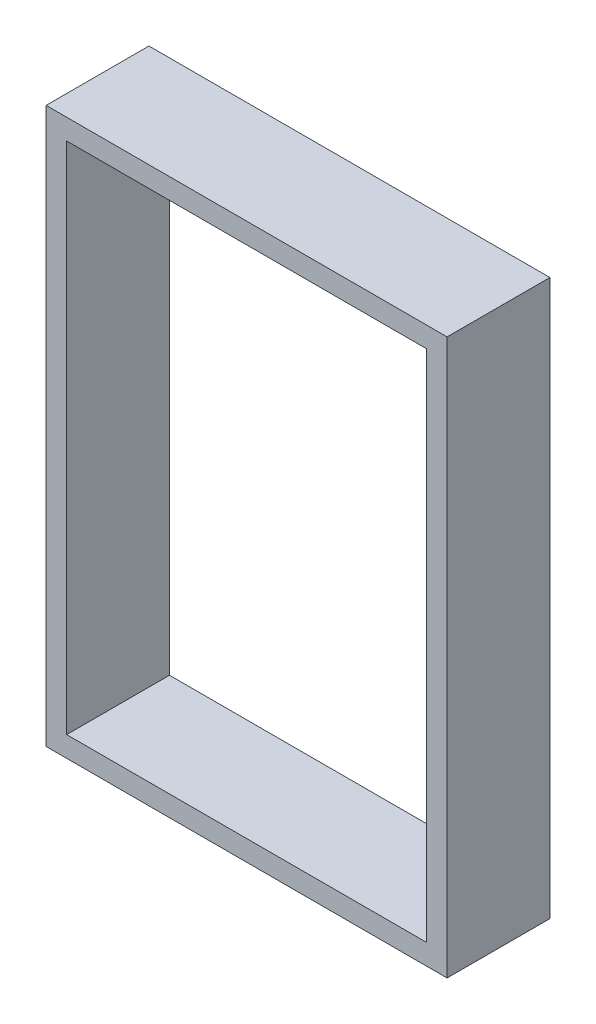
ISO-10303-21;
HEADER;
FILE_DESCRIPTION(('STEP AP214'),'2;1');
FILE_NAME('part.step','',(''),(''),'','','');
FILE_SCHEMA(('AUTOMOTIVE_DESIGN { 1 0 10303 214 1 1 1 1 }'));
ENDSEC;
DATA;
#1=APPLICATION_CONTEXT('core data for automotive mechanical design processes');
#2=APPLICATION_PROTOCOL_DEFINITION('international standard','automotive_design',2000,#1);
#3=PRODUCT_CONTEXT('',#1,'mechanical');
#4=PRODUCT('Part','Part','',(#3));
#5=PRODUCT_RELATED_PRODUCT_CATEGORY('part','',(#4));
#6=PRODUCT_DEFINITION_FORMATION('','',#4);
#7=PRODUCT_DEFINITION_CONTEXT('part definition',#1,'design');
#8=PRODUCT_DEFINITION('design','',#6,#7);
#9=PRODUCT_DEFINITION_SHAPE('','',#8);
#10=(LENGTH_UNIT() NAMED_UNIT(*) SI_UNIT(.MILLI.,.METRE.));
#11=(NAMED_UNIT(*) PLANE_ANGLE_UNIT() SI_UNIT($,.RADIAN.));
#12=(NAMED_UNIT(*) SI_UNIT($,.STERADIAN.) SOLID_ANGLE_UNIT());
#13=UNCERTAINTY_MEASURE_WITH_UNIT(LENGTH_MEASURE(1.E-05),#10,'distance_accuracy_value','');
#14=(GEOMETRIC_REPRESENTATION_CONTEXT(3) GLOBAL_UNCERTAINTY_ASSIGNED_CONTEXT((#13)) GLOBAL_UNIT_ASSIGNED_CONTEXT((#10,
#11,#12)) REPRESENTATION_CONTEXT('',''));
#15=CARTESIAN_POINT('',(0.,0.,0.));
#16=DIRECTION('',(0.,0.,1.));
#17=DIRECTION('',(1.,0.,0.));
#18=AXIS2_PLACEMENT_3D('',#15,#16,#17);
#19=CARTESIAN_POINT('',(0.,0.,1.));
#20=DIRECTION('',(0.,0.,1.));
#21=DIRECTION('',(1.,0.,0.));
#22=AXIS2_PLACEMENT_3D('',#19,#20,#21);
#23=PLANE('',#22);
#24=DIRECTION('',(0.,1.,0.));
#25=VECTOR('',#24,1.);
#26=CARTESIAN_POINT('',(1.95,2.7,1.));
#27=LINE('',#26,#25);
#28=CARTESIAN_POINT('',(1.95,-2.7,1.));
#29=VERTEX_POINT('',#28);
#30=CARTESIAN_POINT('',(1.95,2.7,1.));
#31=VERTEX_POINT('',#30);
#32=EDGE_CURVE('E134',#29,#31,#27,.T.);
#33=ORIENTED_EDGE('',*,*,#32,.T.);
#34=DIRECTION('',(-1.,0.,0.));
#35=VECTOR('',#34,1.);
#36=CARTESIAN_POINT('',(-1.95,2.7,1.));
#37=LINE('',#36,#35);
#38=CARTESIAN_POINT('',(-1.95,2.7,1.));
#39=VERTEX_POINT('',#38);
#40=EDGE_CURVE('E137',#31,#39,#37,.T.);
#41=ORIENTED_EDGE('',*,*,#40,.T.);
#42=DIRECTION('',(0.,-1.,0.));
#43=VECTOR('',#42,1.);
#44=CARTESIAN_POINT('',(-1.95,2.7,1.));
#45=LINE('',#44,#43);
#46=CARTESIAN_POINT('',(-1.95,-2.7,1.));
#47=VERTEX_POINT('',#46);
#48=EDGE_CURVE('E140',#39,#47,#45,.T.);
#49=ORIENTED_EDGE('',*,*,#48,.T.);
#50=DIRECTION('',(1.,0.,0.));
#51=VECTOR('',#50,1.);
#52=CARTESIAN_POINT('',(-1.95,-2.7,1.));
#53=LINE('',#52,#51);
#54=EDGE_CURVE('E142',#47,#29,#53,.T.);
#55=ORIENTED_EDGE('',*,*,#54,.T.);
#56=EDGE_LOOP('',(#33,#41,#49,#55));
#57=FACE_BOUND('',#56,.T.);
#58=DIRECTION('',(-1.,0.,0.));
#59=VECTOR('',#58,1.);
#60=CARTESIAN_POINT('',(-1.75,2.5,1.));
#61=LINE('',#60,#59);
#62=CARTESIAN_POINT('',(1.75,2.5,1.));
#63=VERTEX_POINT('',#62);
#64=CARTESIAN_POINT('',(-1.75,2.5,1.));
#65=VERTEX_POINT('',#64);
#66=EDGE_CURVE('E106',#63,#65,#61,.T.);
#67=ORIENTED_EDGE('',*,*,#66,.F.);
#68=DIRECTION('',(0.,1.,0.));
#69=VECTOR('',#68,1.);
#70=CARTESIAN_POINT('',(1.75,2.5,1.));
#71=LINE('',#70,#69);
#72=CARTESIAN_POINT('',(1.75,-2.5,1.));
#73=VERTEX_POINT('',#72);
#74=EDGE_CURVE('E98',#73,#63,#71,.T.);
#75=ORIENTED_EDGE('',*,*,#74,.F.);
#76=DIRECTION('',(1.,0.,0.));
#77=VECTOR('',#76,1.);
#78=CARTESIAN_POINT('',(-1.75,-2.5,1.));
#79=LINE('',#78,#77);
#80=CARTESIAN_POINT('',(-1.75,-2.5,1.));
#81=VERTEX_POINT('',#80);
#82=EDGE_CURVE('E120',#81,#73,#79,.T.);
#83=ORIENTED_EDGE('',*,*,#82,.F.);
#84=DIRECTION('',(0.,-1.,0.));
#85=VECTOR('',#84,1.);
#86=CARTESIAN_POINT('',(-1.75,2.5,1.));
#87=LINE('',#86,#85);
#88=EDGE_CURVE('E118',#65,#81,#87,.T.);
#89=ORIENTED_EDGE('',*,*,#88,.F.);
#90=EDGE_LOOP('',(#67,#75,#83,#89));
#91=FACE_BOUND('',#90,.T.);
#92=ADVANCED_FACE('F33',(#57,#91),#23,.T.);
#93=CARTESIAN_POINT('',(0.,0.,0.));
#94=DIRECTION('',(0.,0.,1.));
#95=DIRECTION('',(1.,0.,0.));
#96=AXIS2_PLACEMENT_3D('',#93,#94,#95);
#97=PLANE('',#96);
#98=DIRECTION('',(0.,1.,0.));
#99=VECTOR('',#98,1.);
#100=CARTESIAN_POINT('',(1.95,2.7,0.));
#101=LINE('',#100,#99);
#102=CARTESIAN_POINT('',(1.95,-2.7,0.));
#103=VERTEX_POINT('',#102);
#104=CARTESIAN_POINT('',(1.95,2.7,0.));
#105=VERTEX_POINT('',#104);
#106=EDGE_CURVE('E114',#103,#105,#101,.T.);
#107=ORIENTED_EDGE('',*,*,#106,.F.);
#108=DIRECTION('',(1.,0.,0.));
#109=VECTOR('',#108,1.);
#110=CARTESIAN_POINT('',(-1.95,-2.7,0.));
#111=LINE('',#110,#109);
#112=CARTESIAN_POINT('',(-1.95,-2.7,0.));
#113=VERTEX_POINT('',#112);
#114=EDGE_CURVE('E138',#113,#103,#111,.T.);
#115=ORIENTED_EDGE('',*,*,#114,.F.);
#116=DIRECTION('',(0.,-1.,0.));
#117=VECTOR('',#116,1.);
#118=CARTESIAN_POINT('',(-1.95,2.7,0.));
#119=LINE('',#118,#117);
#120=CARTESIAN_POINT('',(-1.95,2.7,0.));
#121=VERTEX_POINT('',#120);
#122=EDGE_CURVE('E149',#121,#113,#119,.T.);
#123=ORIENTED_EDGE('',*,*,#122,.F.);
#124=DIRECTION('',(-1.,0.,0.));
#125=VECTOR('',#124,1.);
#126=CARTESIAN_POINT('',(-1.95,2.7,0.));
#127=LINE('',#126,#125);
#128=EDGE_CURVE('E147',#105,#121,#127,.T.);
#129=ORIENTED_EDGE('',*,*,#128,.F.);
#130=EDGE_LOOP('',(#107,#115,#123,#129));
#131=FACE_BOUND('',#130,.T.);
#132=DIRECTION('',(0.,1.,0.));
#133=VECTOR('',#132,1.);
#134=CARTESIAN_POINT('',(1.75,2.5,0.));
#135=LINE('',#134,#133);
#136=CARTESIAN_POINT('',(1.75,-2.5,0.));
#137=VERTEX_POINT('',#136);
#138=CARTESIAN_POINT('',(1.75,2.5,0.));
#139=VERTEX_POINT('',#138);
#140=EDGE_CURVE('E56',#137,#139,#135,.T.);
#141=ORIENTED_EDGE('',*,*,#140,.T.);
#142=DIRECTION('',(-1.,0.,0.));
#143=VECTOR('',#142,1.);
#144=CARTESIAN_POINT('',(-1.75,2.5,0.));
#145=LINE('',#144,#143);
#146=CARTESIAN_POINT('',(-1.75,2.5,0.));
#147=VERTEX_POINT('',#146);
#148=EDGE_CURVE('E113',#139,#147,#145,.T.);
#149=ORIENTED_EDGE('',*,*,#148,.T.);
#150=DIRECTION('',(0.,-1.,0.));
#151=VECTOR('',#150,1.);
#152=CARTESIAN_POINT('',(-1.75,2.5,0.));
#153=LINE('',#152,#151);
#154=CARTESIAN_POINT('',(-1.75,-2.5,0.));
#155=VERTEX_POINT('',#154);
#156=EDGE_CURVE('E126',#147,#155,#153,.T.);
#157=ORIENTED_EDGE('',*,*,#156,.T.);
#158=DIRECTION('',(1.,0.,0.));
#159=VECTOR('',#158,1.);
#160=CARTESIAN_POINT('',(-1.75,-2.5,0.));
#161=LINE('',#160,#159);
#162=EDGE_CURVE('E107',#155,#137,#161,.T.);
#163=ORIENTED_EDGE('',*,*,#162,.T.);
#164=EDGE_LOOP('',(#141,#149,#157,#163));
#165=FACE_BOUND('',#164,.T.);
#166=ADVANCED_FACE('F167',(#131,#165),#97,.F.);
#167=CARTESIAN_POINT('',(1.95,2.7,1.));
#168=DIRECTION('',(-1.,0.,0.));
#169=DIRECTION('',(0.,0.,1.));
#170=AXIS2_PLACEMENT_3D('',#167,#168,#169);
#171=PLANE('',#170);
#172=ORIENTED_EDGE('',*,*,#106,.T.);
#173=DIRECTION('',(0.,0.,-1.));
#174=VECTOR('',#173,1.);
#175=CARTESIAN_POINT('',(1.95,2.7,1.));
#176=LINE('',#175,#174);
#177=EDGE_CURVE('E11',#31,#105,#176,.T.);
#178=ORIENTED_EDGE('',*,*,#177,.F.);
#179=ORIENTED_EDGE('',*,*,#32,.F.);
#180=DIRECTION('',(0.,0.,-1.));
#181=VECTOR('',#180,1.);
#182=CARTESIAN_POINT('',(1.95,-2.7,1.));
#183=LINE('',#182,#181);
#184=EDGE_CURVE('E144',#29,#103,#183,.T.);
#185=ORIENTED_EDGE('',*,*,#184,.T.);
#186=EDGE_LOOP('',(#172,#178,#179,#185));
#187=FACE_BOUND('',#186,.T.);
#188=ADVANCED_FACE('F35',(#187),#171,.F.);
#189=CARTESIAN_POINT('',(-1.95,2.7,1.));
#190=DIRECTION('',(0.,-1.,0.));
#191=DIRECTION('',(0.,0.,-1.));
#192=AXIS2_PLACEMENT_3D('',#189,#190,#191);
#193=PLANE('',#192);
#194=ORIENTED_EDGE('',*,*,#128,.T.);
#195=DIRECTION('',(0.,0.,-1.));
#196=VECTOR('',#195,1.);
#197=CARTESIAN_POINT('',(-1.95,2.7,1.));
#198=LINE('',#197,#196);
#199=EDGE_CURVE('E41',#39,#121,#198,.T.);
#200=ORIENTED_EDGE('',*,*,#199,.F.);
#201=ORIENTED_EDGE('',*,*,#40,.F.);
#202=ORIENTED_EDGE('',*,*,#177,.T.);
#203=EDGE_LOOP('',(#194,#200,#201,#202));
#204=FACE_BOUND('',#203,.T.);
#205=ADVANCED_FACE('F177',(#204),#193,.F.);
#206=CARTESIAN_POINT('',(-1.95,2.7,1.));
#207=DIRECTION('',(1.,0.,0.));
#208=DIRECTION('',(0.,0.,-1.));
#209=AXIS2_PLACEMENT_3D('',#206,#207,#208);
#210=PLANE('',#209);
#211=ORIENTED_EDGE('',*,*,#122,.T.);
#212=DIRECTION('',(0.,0.,-1.));
#213=VECTOR('',#212,1.);
#214=CARTESIAN_POINT('',(-1.95,-2.7,1.));
#215=LINE('',#214,#213);
#216=EDGE_CURVE('E154',#47,#113,#215,.T.);
#217=ORIENTED_EDGE('',*,*,#216,.F.);
#218=ORIENTED_EDGE('',*,*,#48,.F.);
#219=ORIENTED_EDGE('',*,*,#199,.T.);
#220=EDGE_LOOP('',(#211,#217,#218,#219));
#221=FACE_BOUND('',#220,.T.);
#222=ADVANCED_FACE('F161',(#221),#210,.F.);
#223=CARTESIAN_POINT('',(-1.95,-2.7,1.));
#224=DIRECTION('',(0.,1.,0.));
#225=DIRECTION('',(0.,0.,1.));
#226=AXIS2_PLACEMENT_3D('',#223,#224,#225);
#227=PLANE('',#226);
#228=ORIENTED_EDGE('',*,*,#114,.T.);
#229=ORIENTED_EDGE('',*,*,#184,.F.);
#230=ORIENTED_EDGE('',*,*,#54,.F.);
#231=ORIENTED_EDGE('',*,*,#216,.T.);
#232=EDGE_LOOP('',(#228,#229,#230,#231));
#233=FACE_BOUND('',#232,.T.);
#234=ADVANCED_FACE('F171',(#233),#227,.F.);
#235=CARTESIAN_POINT('',(1.75,2.5,1.));
#236=DIRECTION('',(-1.,0.,0.));
#237=DIRECTION('',(0.,-1.,0.));
#238=AXIS2_PLACEMENT_3D('',#235,#236,#237);
#239=PLANE('',#238);
#240=ORIENTED_EDGE('',*,*,#140,.F.);
#241=DIRECTION('',(0.,0.,-1.));
#242=VECTOR('',#241,1.);
#243=CARTESIAN_POINT('',(1.75,-2.5,1.));
#244=LINE('',#243,#242);
#245=EDGE_CURVE('E102',#73,#137,#244,.T.);
#246=ORIENTED_EDGE('',*,*,#245,.F.);
#247=ORIENTED_EDGE('',*,*,#74,.T.);
#248=DIRECTION('',(0.,0.,-1.));
#249=VECTOR('',#248,1.);
#250=CARTESIAN_POINT('',(1.75,2.5,1.));
#251=LINE('',#250,#249);
#252=EDGE_CURVE('E101',#63,#139,#251,.T.);
#253=ORIENTED_EDGE('',*,*,#252,.T.);
#254=EDGE_LOOP('',(#240,#246,#247,#253));
#255=FACE_BOUND('',#254,.T.);
#256=ADVANCED_FACE('F100',(#255),#239,.T.);
#257=CARTESIAN_POINT('',(-1.75,2.5,1.));
#258=DIRECTION('',(0.,-1.,0.));
#259=DIRECTION('',(0.,0.,-1.));
#260=AXIS2_PLACEMENT_3D('',#257,#258,#259);
#261=PLANE('',#260);
#262=ORIENTED_EDGE('',*,*,#148,.F.);
#263=ORIENTED_EDGE('',*,*,#252,.F.);
#264=ORIENTED_EDGE('',*,*,#66,.T.);
#265=DIRECTION('',(0.,0.,-1.));
#266=VECTOR('',#265,1.);
#267=CARTESIAN_POINT('',(-1.75,2.5,1.));
#268=LINE('',#267,#266);
#269=EDGE_CURVE('E115',#65,#147,#268,.T.);
#270=ORIENTED_EDGE('',*,*,#269,.T.);
#271=EDGE_LOOP('',(#262,#263,#264,#270));
#272=FACE_BOUND('',#271,.T.);
#273=ADVANCED_FACE('F110',(#272),#261,.T.);
#274=CARTESIAN_POINT('',(-1.75,2.5,1.));
#275=DIRECTION('',(1.,0.,0.));
#276=DIRECTION('',(0.,1.,0.));
#277=AXIS2_PLACEMENT_3D('',#274,#275,#276);
#278=PLANE('',#277);
#279=ORIENTED_EDGE('',*,*,#156,.F.);
#280=ORIENTED_EDGE('',*,*,#269,.F.);
#281=ORIENTED_EDGE('',*,*,#88,.T.);
#282=DIRECTION('',(0.,0.,-1.));
#283=VECTOR('',#282,1.);
#284=CARTESIAN_POINT('',(-1.75,-2.5,1.));
#285=LINE('',#284,#283);
#286=EDGE_CURVE('E48',#81,#155,#285,.T.);
#287=ORIENTED_EDGE('',*,*,#286,.T.);
#288=EDGE_LOOP('',(#279,#280,#281,#287));
#289=FACE_BOUND('',#288,.T.);
#290=ADVANCED_FACE('F200',(#289),#278,.T.);
#291=CARTESIAN_POINT('',(-1.75,-2.5,1.));
#292=DIRECTION('',(0.,1.,0.));
#293=DIRECTION('',(0.,0.,1.));
#294=AXIS2_PLACEMENT_3D('',#291,#292,#293);
#295=PLANE('',#294);
#296=ORIENTED_EDGE('',*,*,#162,.F.);
#297=ORIENTED_EDGE('',*,*,#286,.F.);
#298=ORIENTED_EDGE('',*,*,#82,.T.);
#299=ORIENTED_EDGE('',*,*,#245,.T.);
#300=EDGE_LOOP('',(#296,#297,#298,#299));
#301=FACE_BOUND('',#300,.T.);
#302=ADVANCED_FACE('F204',(#301),#295,.T.);
#303=CLOSED_SHELL('',(#92,#166,#188,#205,#222,#234,#256,#273,#290,#302));
#304=MANIFOLD_SOLID_BREP('B2',#303);
#305=ADVANCED_BREP_SHAPE_REPRESENTATION('',(#18,#304),#14);
#306=SHAPE_DEFINITION_REPRESENTATION(#9,#305);
ENDSEC;
END-ISO-10303-21;
